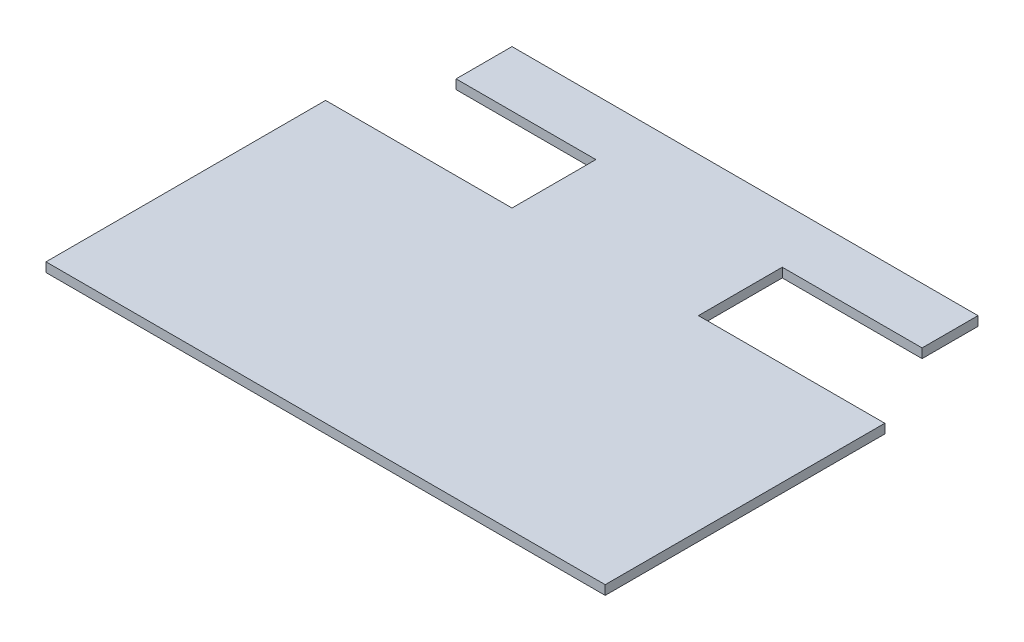
ISO-10303-21;
HEADER;
FILE_DESCRIPTION(('STEP AP214'),'2;1');
FILE_NAME('part.step','',(''),(''),'','','');
FILE_SCHEMA(('AUTOMOTIVE_DESIGN { 1 0 10303 214 1 1 1 1 }'));
ENDSEC;
DATA;
#1=APPLICATION_CONTEXT('core data for automotive mechanical design processes');
#2=APPLICATION_PROTOCOL_DEFINITION('international standard','automotive_design',2000,#1);
#3=PRODUCT_CONTEXT('',#1,'mechanical');
#4=PRODUCT('Part','Part','',(#3));
#5=PRODUCT_RELATED_PRODUCT_CATEGORY('part','',(#4));
#6=PRODUCT_DEFINITION_FORMATION('','',#4);
#7=PRODUCT_DEFINITION_CONTEXT('part definition',#1,'design');
#8=PRODUCT_DEFINITION('design','',#6,#7);
#9=PRODUCT_DEFINITION_SHAPE('','',#8);
#10=(LENGTH_UNIT() NAMED_UNIT(*) SI_UNIT(.MILLI.,.METRE.));
#11=(NAMED_UNIT(*) PLANE_ANGLE_UNIT() SI_UNIT($,.RADIAN.));
#12=(NAMED_UNIT(*) SI_UNIT($,.STERADIAN.) SOLID_ANGLE_UNIT());
#13=UNCERTAINTY_MEASURE_WITH_UNIT(LENGTH_MEASURE(1.E-05),#10,'distance_accuracy_value','');
#14=(GEOMETRIC_REPRESENTATION_CONTEXT(3) GLOBAL_UNCERTAINTY_ASSIGNED_CONTEXT((#13)) GLOBAL_UNIT_ASSIGNED_CONTEXT((#10,
#11,#12)) REPRESENTATION_CONTEXT('',''));
#15=CARTESIAN_POINT('',(0.,0.,0.));
#16=DIRECTION('',(0.,0.,1.));
#17=DIRECTION('',(1.,0.,0.));
#18=AXIS2_PLACEMENT_3D('',#15,#16,#17);
#19=CARTESIAN_POINT('',(-125.,5.,-195.));
#20=DIRECTION('',(-1.,0.,0.));
#21=DIRECTION('',(0.,0.,1.));
#22=AXIS2_PLACEMENT_3D('',#19,#20,#21);
#23=PLANE('',#22);
#24=DIRECTION('',(0.,0.,-1.));
#25=VECTOR('',#24,1.);
#26=CARTESIAN_POINT('',(-125.,0.,-195.));
#27=LINE('',#26,#25);
#28=CARTESIAN_POINT('',(-125.,0.,-195.));
#29=VERTEX_POINT('',#28);
#30=CARTESIAN_POINT('',(-125.,0.,-225.));
#31=VERTEX_POINT('',#30);
#32=EDGE_CURVE('E170',#29,#31,#27,.T.);
#33=ORIENTED_EDGE('',*,*,#32,.F.);
#34=DIRECTION('',(0.,-1.,0.));
#35=VECTOR('',#34,1.);
#36=CARTESIAN_POINT('',(-125.,5.,-195.));
#37=LINE('',#36,#35);
#38=CARTESIAN_POINT('',(-125.,5.,-195.));
#39=VERTEX_POINT('',#38);
#40=EDGE_CURVE('E11',#39,#29,#37,.T.);
#41=ORIENTED_EDGE('',*,*,#40,.F.);
#42=DIRECTION('',(0.,0.,-1.));
#43=VECTOR('',#42,1.);
#44=CARTESIAN_POINT('',(-125.,5.,-195.));
#45=LINE('',#44,#43);
#46=CARTESIAN_POINT('',(-125.,5.,-225.));
#47=VERTEX_POINT('',#46);
#48=EDGE_CURVE('E210',#39,#47,#45,.T.);
#49=ORIENTED_EDGE('',*,*,#48,.T.);
#50=DIRECTION('',(0.,-1.,0.));
#51=VECTOR('',#50,1.);
#52=CARTESIAN_POINT('',(-125.,5.,-225.));
#53=LINE('',#52,#51);
#54=EDGE_CURVE('E46',#47,#31,#53,.T.);
#55=ORIENTED_EDGE('',*,*,#54,.T.);
#56=EDGE_LOOP('',(#33,#41,#49,#55));
#57=FACE_BOUND('',#56,.T.);
#58=ADVANCED_FACE('F43',(#57),#23,.T.);
#59=CARTESIAN_POINT('',(-50.,5.,-195.));
#60=DIRECTION('',(0.,0.,1.));
#61=DIRECTION('',(1.,0.,0.));
#62=AXIS2_PLACEMENT_3D('',#59,#60,#61);
#63=PLANE('',#62);
#64=DIRECTION('',(-1.,0.,0.));
#65=VECTOR('',#64,1.);
#66=CARTESIAN_POINT('',(-50.,0.,-195.));
#67=LINE('',#66,#65);
#68=CARTESIAN_POINT('',(-50.,0.,-195.));
#69=VERTEX_POINT('',#68);
#70=EDGE_CURVE('E207',#69,#29,#67,.T.);
#71=ORIENTED_EDGE('',*,*,#70,.F.);
#72=DIRECTION('',(0.,-1.,0.));
#73=VECTOR('',#72,1.);
#74=CARTESIAN_POINT('',(-50.,5.,-195.));
#75=LINE('',#74,#73);
#76=CARTESIAN_POINT('',(-50.,5.,-195.));
#77=VERTEX_POINT('',#76);
#78=EDGE_CURVE('E53',#77,#69,#75,.T.);
#79=ORIENTED_EDGE('',*,*,#78,.F.);
#80=DIRECTION('',(-1.,0.,0.));
#81=VECTOR('',#80,1.);
#82=CARTESIAN_POINT('',(-50.,5.,-195.));
#83=LINE('',#82,#81);
#84=EDGE_CURVE('E156',#77,#39,#83,.T.);
#85=ORIENTED_EDGE('',*,*,#84,.T.);
#86=ORIENTED_EDGE('',*,*,#40,.T.);
#87=EDGE_LOOP('',(#71,#79,#85,#86));
#88=FACE_BOUND('',#87,.T.);
#89=ADVANCED_FACE('F245',(#88),#63,.T.);
#90=CARTESIAN_POINT('',(-50.,5.,-150.));
#91=DIRECTION('',(-1.,0.,0.));
#92=DIRECTION('',(0.,0.,1.));
#93=AXIS2_PLACEMENT_3D('',#90,#91,#92);
#94=PLANE('',#93);
#95=DIRECTION('',(0.,0.,-1.));
#96=VECTOR('',#95,1.);
#97=CARTESIAN_POINT('',(-50.,0.,-150.));
#98=LINE('',#97,#96);
#99=CARTESIAN_POINT('',(-50.,0.,-150.));
#100=VERTEX_POINT('',#99);
#101=EDGE_CURVE('E142',#100,#69,#98,.T.);
#102=ORIENTED_EDGE('',*,*,#101,.F.);
#103=DIRECTION('',(0.,-1.,0.));
#104=VECTOR('',#103,1.);
#105=CARTESIAN_POINT('',(-50.,5.,-150.));
#106=LINE('',#105,#104);
#107=CARTESIAN_POINT('',(-50.,5.,-150.));
#108=VERTEX_POINT('',#107);
#109=EDGE_CURVE('E137',#108,#100,#106,.T.);
#110=ORIENTED_EDGE('',*,*,#109,.F.);
#111=DIRECTION('',(0.,0.,-1.));
#112=VECTOR('',#111,1.);
#113=CARTESIAN_POINT('',(-50.,5.,-150.));
#114=LINE('',#113,#112);
#115=EDGE_CURVE('E140',#108,#77,#114,.T.);
#116=ORIENTED_EDGE('',*,*,#115,.T.);
#117=ORIENTED_EDGE('',*,*,#78,.T.);
#118=EDGE_LOOP('',(#102,#110,#116,#117));
#119=FACE_BOUND('',#118,.T.);
#120=ADVANCED_FACE('F139',(#119),#94,.T.);
#121=CARTESIAN_POINT('',(-150.,5.,-150.));
#122=DIRECTION('',(0.,0.,-1.));
#123=DIRECTION('',(-1.,0.,0.));
#124=AXIS2_PLACEMENT_3D('',#121,#122,#123);
#125=PLANE('',#124);
#126=DIRECTION('',(1.,0.,0.));
#127=VECTOR('',#126,1.);
#128=CARTESIAN_POINT('',(-150.,0.,-150.));
#129=LINE('',#128,#127);
#130=CARTESIAN_POINT('',(-150.,0.,-150.));
#131=VERTEX_POINT('',#130);
#132=EDGE_CURVE('E202',#131,#100,#129,.T.);
#133=ORIENTED_EDGE('',*,*,#132,.F.);
#134=DIRECTION('',(0.,-1.,0.));
#135=VECTOR('',#134,1.);
#136=CARTESIAN_POINT('',(-150.,5.,-150.));
#137=LINE('',#136,#135);
#138=CARTESIAN_POINT('',(-150.,5.,-150.));
#139=VERTEX_POINT('',#138);
#140=EDGE_CURVE('E148',#139,#131,#137,.T.);
#141=ORIENTED_EDGE('',*,*,#140,.F.);
#142=DIRECTION('',(1.,0.,0.));
#143=VECTOR('',#142,1.);
#144=CARTESIAN_POINT('',(-150.,5.,-150.));
#145=LINE('',#144,#143);
#146=EDGE_CURVE('E154',#139,#108,#145,.T.);
#147=ORIENTED_EDGE('',*,*,#146,.T.);
#148=ORIENTED_EDGE('',*,*,#109,.T.);
#149=EDGE_LOOP('',(#133,#141,#147,#148));
#150=FACE_BOUND('',#149,.T.);
#151=ADVANCED_FACE('F159',(#150),#125,.T.);
#152=CARTESIAN_POINT('',(-150.,5.,0.));
#153=DIRECTION('',(-1.,0.,0.));
#154=DIRECTION('',(0.,0.,1.));
#155=AXIS2_PLACEMENT_3D('',#152,#153,#154);
#156=PLANE('',#155);
#157=DIRECTION('',(0.,0.,-1.));
#158=VECTOR('',#157,1.);
#159=CARTESIAN_POINT('',(-150.,0.,0.));
#160=LINE('',#159,#158);
#161=CARTESIAN_POINT('',(-150.,0.,0.));
#162=VERTEX_POINT('',#161);
#163=EDGE_CURVE('E198',#162,#131,#160,.T.);
#164=ORIENTED_EDGE('',*,*,#163,.F.);
#165=DIRECTION('',(0.,-1.,0.));
#166=VECTOR('',#165,1.);
#167=CARTESIAN_POINT('',(-150.,5.,0.));
#168=LINE('',#167,#166);
#169=CARTESIAN_POINT('',(-150.,5.,0.));
#170=VERTEX_POINT('',#169);
#171=EDGE_CURVE('E216',#170,#162,#168,.T.);
#172=ORIENTED_EDGE('',*,*,#171,.F.);
#173=DIRECTION('',(0.,0.,-1.));
#174=VECTOR('',#173,1.);
#175=CARTESIAN_POINT('',(-150.,5.,0.));
#176=LINE('',#175,#174);
#177=EDGE_CURVE('E161',#170,#139,#176,.T.);
#178=ORIENTED_EDGE('',*,*,#177,.T.);
#179=ORIENTED_EDGE('',*,*,#140,.T.);
#180=EDGE_LOOP('',(#164,#172,#178,#179));
#181=FACE_BOUND('',#180,.T.);
#182=ADVANCED_FACE('F258',(#181),#156,.T.);
#183=CARTESIAN_POINT('',(150.,5.,0.));
#184=DIRECTION('',(0.,0.,1.));
#185=DIRECTION('',(1.,0.,0.));
#186=AXIS2_PLACEMENT_3D('',#183,#184,#185);
#187=PLANE('',#186);
#188=DIRECTION('',(-1.,0.,0.));
#189=VECTOR('',#188,1.);
#190=CARTESIAN_POINT('',(150.,0.,0.));
#191=LINE('',#190,#189);
#192=CARTESIAN_POINT('',(150.,0.,0.));
#193=VERTEX_POINT('',#192);
#194=EDGE_CURVE('E194',#193,#162,#191,.T.);
#195=ORIENTED_EDGE('',*,*,#194,.F.);
#196=DIRECTION('',(0.,-1.,0.));
#197=VECTOR('',#196,1.);
#198=CARTESIAN_POINT('',(150.,5.,0.));
#199=LINE('',#198,#197);
#200=CARTESIAN_POINT('',(150.,5.,0.));
#201=VERTEX_POINT('',#200);
#202=EDGE_CURVE('E219',#201,#193,#199,.T.);
#203=ORIENTED_EDGE('',*,*,#202,.F.);
#204=DIRECTION('',(-1.,0.,0.));
#205=VECTOR('',#204,1.);
#206=CARTESIAN_POINT('',(150.,5.,0.));
#207=LINE('',#206,#205);
#208=EDGE_CURVE('E164',#201,#170,#207,.T.);
#209=ORIENTED_EDGE('',*,*,#208,.T.);
#210=ORIENTED_EDGE('',*,*,#171,.T.);
#211=EDGE_LOOP('',(#195,#203,#209,#210));
#212=FACE_BOUND('',#211,.T.);
#213=ADVANCED_FACE('F261',(#212),#187,.T.);
#214=CARTESIAN_POINT('',(150.,5.,0.));
#215=DIRECTION('',(-1.,0.,0.));
#216=DIRECTION('',(0.,0.,1.));
#217=AXIS2_PLACEMENT_3D('',#214,#215,#216);
#218=PLANE('',#217);
#219=DIRECTION('',(0.,0.,-1.));
#220=VECTOR('',#219,1.);
#221=CARTESIAN_POINT('',(150.,0.,0.));
#222=LINE('',#221,#220);
#223=CARTESIAN_POINT('',(150.,0.,-150.));
#224=VERTEX_POINT('',#223);
#225=EDGE_CURVE('E191',#193,#224,#222,.T.);
#226=ORIENTED_EDGE('',*,*,#225,.T.);
#227=DIRECTION('',(0.,-1.,0.));
#228=VECTOR('',#227,1.);
#229=CARTESIAN_POINT('',(150.,5.,-150.));
#230=LINE('',#229,#228);
#231=CARTESIAN_POINT('',(150.,5.,-150.));
#232=VERTEX_POINT('',#231);
#233=EDGE_CURVE('E222',#232,#224,#230,.T.);
#234=ORIENTED_EDGE('',*,*,#233,.F.);
#235=DIRECTION('',(0.,0.,-1.));
#236=VECTOR('',#235,1.);
#237=CARTESIAN_POINT('',(150.,5.,0.));
#238=LINE('',#237,#236);
#239=EDGE_CURVE('E418',#201,#232,#238,.T.);
#240=ORIENTED_EDGE('',*,*,#239,.F.);
#241=ORIENTED_EDGE('',*,*,#202,.T.);
#242=EDGE_LOOP('',(#226,#234,#240,#241));
#243=FACE_BOUND('',#242,.T.);
#244=ADVANCED_FACE('F265',(#243),#218,.F.);
#245=CARTESIAN_POINT('',(150.,5.,-150.));
#246=DIRECTION('',(0.,0.,1.));
#247=DIRECTION('',(1.,0.,0.));
#248=AXIS2_PLACEMENT_3D('',#245,#246,#247);
#249=PLANE('',#248);
#250=DIRECTION('',(-1.,0.,0.));
#251=VECTOR('',#250,1.);
#252=CARTESIAN_POINT('',(150.,0.,-150.));
#253=LINE('',#252,#251);
#254=CARTESIAN_POINT('',(50.,0.,-150.));
#255=VERTEX_POINT('',#254);
#256=EDGE_CURVE('E188',#224,#255,#253,.T.);
#257=ORIENTED_EDGE('',*,*,#256,.T.);
#258=DIRECTION('',(0.,-1.,0.));
#259=VECTOR('',#258,1.);
#260=CARTESIAN_POINT('',(50.,5.,-150.));
#261=LINE('',#260,#259);
#262=CARTESIAN_POINT('',(50.,5.,-150.));
#263=VERTEX_POINT('',#262);
#264=EDGE_CURVE('E226',#263,#255,#261,.T.);
#265=ORIENTED_EDGE('',*,*,#264,.F.);
#266=DIRECTION('',(-1.,0.,0.));
#267=VECTOR('',#266,1.);
#268=CARTESIAN_POINT('',(150.,5.,-150.));
#269=LINE('',#268,#267);
#270=EDGE_CURVE('E410',#232,#263,#269,.T.);
#271=ORIENTED_EDGE('',*,*,#270,.F.);
#272=ORIENTED_EDGE('',*,*,#233,.T.);
#273=EDGE_LOOP('',(#257,#265,#271,#272));
#274=FACE_BOUND('',#273,.T.);
#275=ADVANCED_FACE('F269',(#274),#249,.F.);
#276=CARTESIAN_POINT('',(50.,5.,-150.));
#277=DIRECTION('',(-1.,0.,0.));
#278=DIRECTION('',(0.,0.,1.));
#279=AXIS2_PLACEMENT_3D('',#276,#277,#278);
#280=PLANE('',#279);
#281=DIRECTION('',(0.,0.,-1.));
#282=VECTOR('',#281,1.);
#283=CARTESIAN_POINT('',(50.,0.,-150.));
#284=LINE('',#283,#282);
#285=CARTESIAN_POINT('',(50.,0.,-195.));
#286=VERTEX_POINT('',#285);
#287=EDGE_CURVE('E185',#255,#286,#284,.T.);
#288=ORIENTED_EDGE('',*,*,#287,.T.);
#289=DIRECTION('',(0.,-1.,0.));
#290=VECTOR('',#289,1.);
#291=CARTESIAN_POINT('',(50.,5.,-195.));
#292=LINE('',#291,#290);
#293=CARTESIAN_POINT('',(50.,5.,-195.));
#294=VERTEX_POINT('',#293);
#295=EDGE_CURVE('E230',#294,#286,#292,.T.);
#296=ORIENTED_EDGE('',*,*,#295,.F.);
#297=DIRECTION('',(0.,0.,-1.));
#298=VECTOR('',#297,1.);
#299=CARTESIAN_POINT('',(50.,5.,-150.));
#300=LINE('',#299,#298);
#301=EDGE_CURVE('E407',#263,#294,#300,.T.);
#302=ORIENTED_EDGE('',*,*,#301,.F.);
#303=ORIENTED_EDGE('',*,*,#264,.T.);
#304=EDGE_LOOP('',(#288,#296,#302,#303));
#305=FACE_BOUND('',#304,.T.);
#306=ADVANCED_FACE('F273',(#305),#280,.F.);
#307=CARTESIAN_POINT('',(50.,5.,-195.));
#308=DIRECTION('',(0.,0.,-1.));
#309=DIRECTION('',(-1.,0.,0.));
#310=AXIS2_PLACEMENT_3D('',#307,#308,#309);
#311=PLANE('',#310);
#312=DIRECTION('',(1.,0.,0.));
#313=VECTOR('',#312,1.);
#314=CARTESIAN_POINT('',(50.,0.,-195.));
#315=LINE('',#314,#313);
#316=CARTESIAN_POINT('',(125.,0.,-195.));
#317=VERTEX_POINT('',#316);
#318=EDGE_CURVE('E182',#286,#317,#315,.T.);
#319=ORIENTED_EDGE('',*,*,#318,.T.);
#320=DIRECTION('',(0.,-1.,0.));
#321=VECTOR('',#320,1.);
#322=CARTESIAN_POINT('',(125.,5.,-195.));
#323=LINE('',#322,#321);
#324=CARTESIAN_POINT('',(125.,5.,-195.));
#325=VERTEX_POINT('',#324);
#326=EDGE_CURVE('E234',#325,#317,#323,.T.);
#327=ORIENTED_EDGE('',*,*,#326,.F.);
#328=DIRECTION('',(1.,0.,0.));
#329=VECTOR('',#328,1.);
#330=CARTESIAN_POINT('',(50.,5.,-195.));
#331=LINE('',#330,#329);
#332=EDGE_CURVE('E405',#294,#325,#331,.T.);
#333=ORIENTED_EDGE('',*,*,#332,.F.);
#334=ORIENTED_EDGE('',*,*,#295,.T.);
#335=EDGE_LOOP('',(#319,#327,#333,#334));
#336=FACE_BOUND('',#335,.T.);
#337=ADVANCED_FACE('F277',(#336),#311,.F.);
#338=CARTESIAN_POINT('',(125.,5.,-195.));
#339=DIRECTION('',(-1.,0.,0.));
#340=DIRECTION('',(0.,0.,1.));
#341=AXIS2_PLACEMENT_3D('',#338,#339,#340);
#342=PLANE('',#341);
#343=DIRECTION('',(0.,0.,-1.));
#344=VECTOR('',#343,1.);
#345=CARTESIAN_POINT('',(125.,0.,-195.));
#346=LINE('',#345,#344);
#347=CARTESIAN_POINT('',(125.,0.,-225.));
#348=VERTEX_POINT('',#347);
#349=EDGE_CURVE('E178',#317,#348,#346,.T.);
#350=ORIENTED_EDGE('',*,*,#349,.T.);
#351=DIRECTION('',(0.,-1.,0.));
#352=VECTOR('',#351,1.);
#353=CARTESIAN_POINT('',(125.,5.,-225.));
#354=LINE('',#353,#352);
#355=CARTESIAN_POINT('',(125.,5.,-225.));
#356=VERTEX_POINT('',#355);
#357=EDGE_CURVE('E237',#356,#348,#354,.T.);
#358=ORIENTED_EDGE('',*,*,#357,.F.);
#359=DIRECTION('',(0.,0.,-1.));
#360=VECTOR('',#359,1.);
#361=CARTESIAN_POINT('',(125.,5.,-195.));
#362=LINE('',#361,#360);
#363=EDGE_CURVE('E429',#325,#356,#362,.T.);
#364=ORIENTED_EDGE('',*,*,#363,.F.);
#365=ORIENTED_EDGE('',*,*,#326,.T.);
#366=EDGE_LOOP('',(#350,#358,#364,#365));
#367=FACE_BOUND('',#366,.T.);
#368=ADVANCED_FACE('F281',(#367),#342,.F.);
#369=CARTESIAN_POINT('',(-125.,5.,-225.));
#370=DIRECTION('',(0.,0.,-1.));
#371=DIRECTION('',(-1.,0.,0.));
#372=AXIS2_PLACEMENT_3D('',#369,#370,#371);
#373=PLANE('',#372);
#374=DIRECTION('',(1.,0.,0.));
#375=VECTOR('',#374,1.);
#376=CARTESIAN_POINT('',(-125.,0.,-225.));
#377=LINE('',#376,#375);
#378=EDGE_CURVE('E174',#31,#348,#377,.T.);
#379=ORIENTED_EDGE('',*,*,#378,.F.);
#380=ORIENTED_EDGE('',*,*,#54,.F.);
#381=DIRECTION('',(1.,0.,0.));
#382=VECTOR('',#381,1.);
#383=CARTESIAN_POINT('',(-125.,5.,-225.));
#384=LINE('',#383,#382);
#385=EDGE_CURVE('E432',#47,#356,#384,.T.);
#386=ORIENTED_EDGE('',*,*,#385,.T.);
#387=ORIENTED_EDGE('',*,*,#357,.T.);
#388=EDGE_LOOP('',(#379,#380,#386,#387));
#389=FACE_BOUND('',#388,.T.);
#390=ADVANCED_FACE('F241',(#389),#373,.T.);
#391=CARTESIAN_POINT('',(0.,5.,0.));
#392=DIRECTION('',(0.,-1.,0.));
#393=DIRECTION('',(0.,0.,-1.));
#394=AXIS2_PLACEMENT_3D('',#391,#392,#393);
#395=PLANE('',#394);
#396=ORIENTED_EDGE('',*,*,#48,.F.);
#397=ORIENTED_EDGE('',*,*,#84,.F.);
#398=ORIENTED_EDGE('',*,*,#115,.F.);
#399=ORIENTED_EDGE('',*,*,#146,.F.);
#400=ORIENTED_EDGE('',*,*,#177,.F.);
#401=ORIENTED_EDGE('',*,*,#208,.F.);
#402=ORIENTED_EDGE('',*,*,#239,.T.);
#403=ORIENTED_EDGE('',*,*,#270,.T.);
#404=ORIENTED_EDGE('',*,*,#301,.T.);
#405=ORIENTED_EDGE('',*,*,#332,.T.);
#406=ORIENTED_EDGE('',*,*,#363,.T.);
#407=ORIENTED_EDGE('',*,*,#385,.F.);
#408=EDGE_LOOP('',(#396,#397,#398,#399,#400,#401,#402,#403,#404,#405,#406,#407));
#409=FACE_BOUND('',#408,.T.);
#410=ADVANCED_FACE('F152',(#409),#395,.F.);
#411=CARTESIAN_POINT('',(0.,0.,0.));
#412=DIRECTION('',(0.,-1.,0.));
#413=DIRECTION('',(0.,0.,-1.));
#414=AXIS2_PLACEMENT_3D('',#411,#412,#413);
#415=PLANE('',#414);
#416=ORIENTED_EDGE('',*,*,#32,.T.);
#417=ORIENTED_EDGE('',*,*,#378,.T.);
#418=ORIENTED_EDGE('',*,*,#349,.F.);
#419=ORIENTED_EDGE('',*,*,#318,.F.);
#420=ORIENTED_EDGE('',*,*,#287,.F.);
#421=ORIENTED_EDGE('',*,*,#256,.F.);
#422=ORIENTED_EDGE('',*,*,#225,.F.);
#423=ORIENTED_EDGE('',*,*,#194,.T.);
#424=ORIENTED_EDGE('',*,*,#163,.T.);
#425=ORIENTED_EDGE('',*,*,#132,.T.);
#426=ORIENTED_EDGE('',*,*,#101,.T.);
#427=ORIENTED_EDGE('',*,*,#70,.T.);
#428=EDGE_LOOP('',(#416,#417,#418,#419,#420,#421,#422,#423,#424,#425,#426,#427));
#429=FACE_BOUND('',#428,.T.);
#430=ADVANCED_FACE('F244',(#429),#415,.T.);
#431=CLOSED_SHELL('',(#58,#89,#120,#151,#182,#213,#244,#275,#306,#337,#368,#390,#410,#430));
#432=MANIFOLD_SOLID_BREP('B2',#431);
#433=ADVANCED_BREP_SHAPE_REPRESENTATION('',(#18,#432),#14);
#434=SHAPE_DEFINITION_REPRESENTATION(#9,#433);
ENDSEC;
END-ISO-10303-21;
